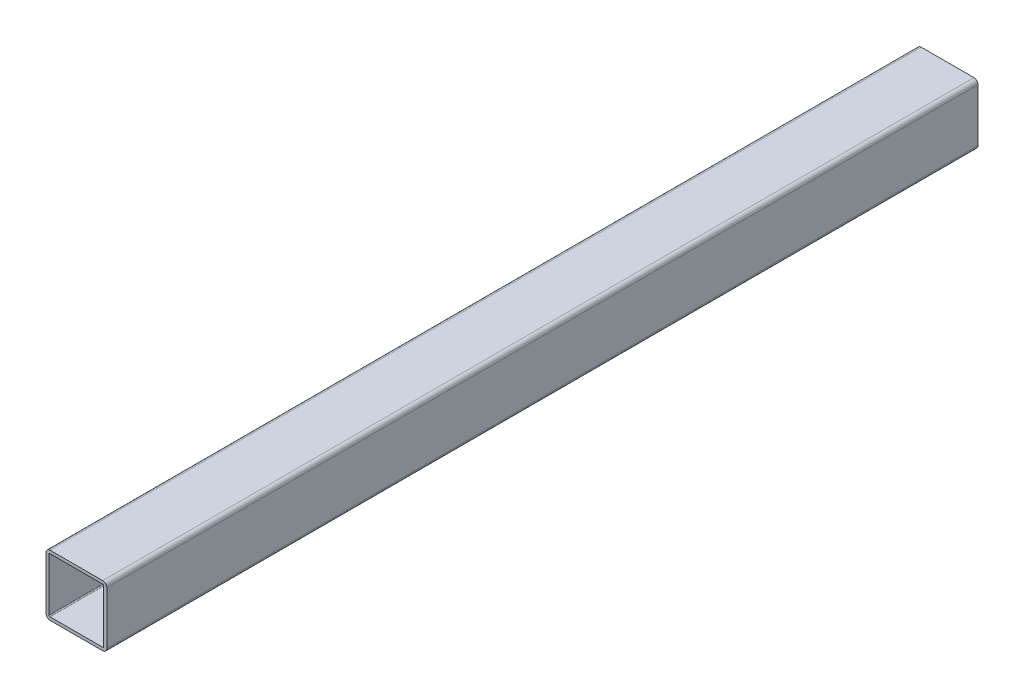
ISO-10303-21;
HEADER;
FILE_DESCRIPTION(('STEP AP214'),'2;1');
FILE_NAME('part.step','',(''),(''),'','','');
FILE_SCHEMA(('AUTOMOTIVE_DESIGN { 1 0 10303 214 1 1 1 1 }'));
ENDSEC;
DATA;
#1=APPLICATION_CONTEXT('core data for automotive mechanical design processes');
#2=APPLICATION_PROTOCOL_DEFINITION('international standard','automotive_design',2000,#1);
#3=PRODUCT_CONTEXT('',#1,'mechanical');
#4=PRODUCT('Part','Part','',(#3));
#5=PRODUCT_RELATED_PRODUCT_CATEGORY('part','',(#4));
#6=PRODUCT_DEFINITION_FORMATION('','',#4);
#7=PRODUCT_DEFINITION_CONTEXT('part definition',#1,'design');
#8=PRODUCT_DEFINITION('design','',#6,#7);
#9=PRODUCT_DEFINITION_SHAPE('','',#8);
#10=(LENGTH_UNIT() NAMED_UNIT(*) SI_UNIT(.MILLI.,.METRE.));
#11=(NAMED_UNIT(*) PLANE_ANGLE_UNIT() SI_UNIT($,.RADIAN.));
#12=(NAMED_UNIT(*) SI_UNIT($,.STERADIAN.) SOLID_ANGLE_UNIT());
#13=UNCERTAINTY_MEASURE_WITH_UNIT(LENGTH_MEASURE(1.E-05),#10,'distance_accuracy_value','');
#14=(GEOMETRIC_REPRESENTATION_CONTEXT(3) GLOBAL_UNCERTAINTY_ASSIGNED_CONTEXT((#13)) GLOBAL_UNIT_ASSIGNED_CONTEXT((#10,
#11,#12)) REPRESENTATION_CONTEXT('',''));
#15=CARTESIAN_POINT('',(0.,0.,0.));
#16=DIRECTION('',(0.,0.,1.));
#17=DIRECTION('',(1.,0.,0.));
#18=AXIS2_PLACEMENT_3D('',#15,#16,#17);
#19=CARTESIAN_POINT('',(2.,2.,430.));
#20=DIRECTION('',(0.,0.,1.));
#21=DIRECTION('',(1.,0.,0.));
#22=AXIS2_PLACEMENT_3D('',#19,#20,#21);
#23=PLANE('',#22);
#24=CARTESIAN_POINT('',(2.,2.,430.));
#25=DIRECTION('',(0.,0.,1.));
#26=DIRECTION('',(1.,0.,0.));
#27=AXIS2_PLACEMENT_3D('',#24,#25,#26);
#28=CIRCLE('',#27,2.);
#29=CARTESIAN_POINT('',(0.,2.00000000000001,430.));
#30=VERTEX_POINT('',#29);
#31=CARTESIAN_POINT('',(2.00000000000001,0.,430.));
#32=VERTEX_POINT('',#31);
#33=EDGE_CURVE('E260',#30,#32,#28,.T.);
#34=ORIENTED_EDGE('',*,*,#33,.T.);
#35=DIRECTION('',(1.,0.,0.));
#36=VECTOR('',#35,1.);
#37=CARTESIAN_POINT('',(2.00000000000001,0.,430.));
#38=LINE('',#37,#36);
#39=CARTESIAN_POINT('',(28.,0.,430.));
#40=VERTEX_POINT('',#39);
#41=EDGE_CURVE('E263',#32,#40,#38,.T.);
#42=ORIENTED_EDGE('',*,*,#41,.T.);
#43=CARTESIAN_POINT('',(28.,2.,430.));
#44=DIRECTION('',(0.,0.,1.));
#45=DIRECTION('',(-1.,0.,0.));
#46=AXIS2_PLACEMENT_3D('',#43,#44,#45);
#47=CIRCLE('',#46,2.);
#48=CARTESIAN_POINT('',(30.,2.00000000000001,430.));
#49=VERTEX_POINT('',#48);
#50=EDGE_CURVE('E266',#40,#49,#47,.T.);
#51=ORIENTED_EDGE('',*,*,#50,.T.);
#52=DIRECTION('',(0.,1.,0.));
#53=VECTOR('',#52,1.);
#54=CARTESIAN_POINT('',(30.,2.00000000000001,430.));
#55=LINE('',#54,#53);
#56=CARTESIAN_POINT('',(30.,28.,430.));
#57=VERTEX_POINT('',#56);
#58=EDGE_CURVE('E268',#49,#57,#55,.T.);
#59=ORIENTED_EDGE('',*,*,#58,.T.);
#60=CARTESIAN_POINT('',(28.,28.,430.));
#61=DIRECTION('',(0.,0.,1.));
#62=DIRECTION('',(-1.,0.,0.));
#63=AXIS2_PLACEMENT_3D('',#60,#61,#62);
#64=CIRCLE('',#63,2.);
#65=CARTESIAN_POINT('',(28.,30.,430.));
#66=VERTEX_POINT('',#65);
#67=EDGE_CURVE('E270',#57,#66,#64,.T.);
#68=ORIENTED_EDGE('',*,*,#67,.T.);
#69=DIRECTION('',(-1.,0.,0.));
#70=VECTOR('',#69,1.);
#71=CARTESIAN_POINT('',(2.00000000000001,30.,430.));
#72=LINE('',#71,#70);
#73=CARTESIAN_POINT('',(2.00000000000001,30.,430.));
#74=VERTEX_POINT('',#73);
#75=EDGE_CURVE('E272',#66,#74,#72,.T.);
#76=ORIENTED_EDGE('',*,*,#75,.T.);
#77=CARTESIAN_POINT('',(2.,28.,430.));
#78=DIRECTION('',(0.,0.,1.));
#79=DIRECTION('',(1.,0.,0.));
#80=AXIS2_PLACEMENT_3D('',#77,#78,#79);
#81=CIRCLE('',#80,2.);
#82=CARTESIAN_POINT('',(0.,28.,430.));
#83=VERTEX_POINT('',#82);
#84=EDGE_CURVE('E274',#74,#83,#81,.T.);
#85=ORIENTED_EDGE('',*,*,#84,.T.);
#86=DIRECTION('',(0.,-1.,0.));
#87=VECTOR('',#86,1.);
#88=CARTESIAN_POINT('',(0.,2.00000000000001,430.));
#89=LINE('',#88,#87);
#90=EDGE_CURVE('E276',#83,#30,#89,.T.);
#91=ORIENTED_EDGE('',*,*,#90,.T.);
#92=EDGE_LOOP('',(#34,#42,#51,#59,#68,#76,#85,#91));
#93=FACE_BOUND('',#92,.T.);
#94=DIRECTION('',(1.,0.,0.));
#95=VECTOR('',#94,1.);
#96=CARTESIAN_POINT('',(2.00000000000001,1.5,430.));
#97=LINE('',#96,#95);
#98=CARTESIAN_POINT('',(2.00000000000001,1.5,430.));
#99=VERTEX_POINT('',#98);
#100=CARTESIAN_POINT('',(28.,1.5,430.));
#101=VERTEX_POINT('',#100);
#102=EDGE_CURVE('E203',#99,#101,#97,.T.);
#103=ORIENTED_EDGE('',*,*,#102,.F.);
#104=CARTESIAN_POINT('',(2.,2.,430.));
#105=DIRECTION('',(0.,0.,1.));
#106=DIRECTION('',(1.,0.,0.));
#107=AXIS2_PLACEMENT_3D('',#104,#105,#106);
#108=CIRCLE('',#107,0.5);
#109=CARTESIAN_POINT('',(1.5,2.00000000000001,430.));
#110=VERTEX_POINT('',#109);
#111=EDGE_CURVE('E195',#110,#99,#108,.T.);
#112=ORIENTED_EDGE('',*,*,#111,.F.);
#113=DIRECTION('',(0.,-1.,0.));
#114=VECTOR('',#113,1.);
#115=CARTESIAN_POINT('',(1.5,2.00000000000001,430.));
#116=LINE('',#115,#114);
#117=CARTESIAN_POINT('',(1.5,28.,430.));
#118=VERTEX_POINT('',#117);
#119=EDGE_CURVE('E228',#118,#110,#116,.T.);
#120=ORIENTED_EDGE('',*,*,#119,.F.);
#121=CARTESIAN_POINT('',(2.,28.,430.));
#122=DIRECTION('',(0.,0.,1.));
#123=DIRECTION('',(1.,0.,0.));
#124=AXIS2_PLACEMENT_3D('',#121,#122,#123);
#125=CIRCLE('',#124,0.500000000000001);
#126=CARTESIAN_POINT('',(2.00000000000001,28.5,430.));
#127=VERTEX_POINT('',#126);
#128=EDGE_CURVE('E226',#127,#118,#125,.T.);
#129=ORIENTED_EDGE('',*,*,#128,.F.);
#130=DIRECTION('',(-1.,0.,0.));
#131=VECTOR('',#130,1.);
#132=CARTESIAN_POINT('',(2.00000000000001,28.5,430.));
#133=LINE('',#132,#131);
#134=CARTESIAN_POINT('',(28.,28.5,430.));
#135=VERTEX_POINT('',#134);
#136=EDGE_CURVE('E224',#135,#127,#133,.T.);
#137=ORIENTED_EDGE('',*,*,#136,.F.);
#138=CARTESIAN_POINT('',(28.,28.,430.));
#139=DIRECTION('',(0.,0.,1.));
#140=DIRECTION('',(1.,0.,0.));
#141=AXIS2_PLACEMENT_3D('',#138,#139,#140);
#142=CIRCLE('',#141,0.500000000000002);
#143=CARTESIAN_POINT('',(28.5,28.,430.));
#144=VERTEX_POINT('',#143);
#145=EDGE_CURVE('E222',#144,#135,#142,.T.);
#146=ORIENTED_EDGE('',*,*,#145,.F.);
#147=DIRECTION('',(0.,1.,0.));
#148=VECTOR('',#147,1.);
#149=CARTESIAN_POINT('',(28.5,2.00000000000001,430.));
#150=LINE('',#149,#148);
#151=CARTESIAN_POINT('',(28.5,2.,430.));
#152=VERTEX_POINT('',#151);
#153=EDGE_CURVE('E218',#152,#144,#150,.T.);
#154=ORIENTED_EDGE('',*,*,#153,.F.);
#155=CARTESIAN_POINT('',(28.,2.,430.));
#156=DIRECTION('',(0.,0.,1.));
#157=DIRECTION('',(1.,0.,0.));
#158=AXIS2_PLACEMENT_3D('',#155,#156,#157);
#159=CIRCLE('',#158,0.500000000000001);
#160=EDGE_CURVE('E216',#101,#152,#159,.T.);
#161=ORIENTED_EDGE('',*,*,#160,.F.);
#162=EDGE_LOOP('',(#103,#112,#120,#129,#137,#146,#154,#161));
#163=FACE_BOUND('',#162,.T.);
#164=ADVANCED_FACE('F82',(#93,#163),#23,.T.);
#165=CARTESIAN_POINT('',(2.,2.,0.));
#166=DIRECTION('',(0.,0.,1.));
#167=DIRECTION('',(1.,0.,0.));
#168=AXIS2_PLACEMENT_3D('',#165,#166,#167);
#169=PLANE('',#168);
#170=CARTESIAN_POINT('',(2.,2.,0.));
#171=DIRECTION('',(0.,0.,1.));
#172=DIRECTION('',(1.,0.,0.));
#173=AXIS2_PLACEMENT_3D('',#170,#171,#172);
#174=CIRCLE('',#173,2.);
#175=CARTESIAN_POINT('',(0.,2.00000000000001,0.));
#176=VERTEX_POINT('',#175);
#177=CARTESIAN_POINT('',(2.00000000000001,0.,0.));
#178=VERTEX_POINT('',#177);
#179=EDGE_CURVE('E211',#176,#178,#174,.T.);
#180=ORIENTED_EDGE('',*,*,#179,.F.);
#181=DIRECTION('',(0.,-1.,0.));
#182=VECTOR('',#181,1.);
#183=CARTESIAN_POINT('',(0.,2.00000000000001,0.));
#184=LINE('',#183,#182);
#185=CARTESIAN_POINT('',(0.,28.,0.));
#186=VERTEX_POINT('',#185);
#187=EDGE_CURVE('E264',#186,#176,#184,.T.);
#188=ORIENTED_EDGE('',*,*,#187,.F.);
#189=CARTESIAN_POINT('',(2.,28.,0.));
#190=DIRECTION('',(0.,0.,1.));
#191=DIRECTION('',(1.,0.,0.));
#192=AXIS2_PLACEMENT_3D('',#189,#190,#191);
#193=CIRCLE('',#192,2.);
#194=CARTESIAN_POINT('',(2.00000000000001,30.,0.));
#195=VERTEX_POINT('',#194);
#196=EDGE_CURVE('E291',#195,#186,#193,.T.);
#197=ORIENTED_EDGE('',*,*,#196,.F.);
#198=DIRECTION('',(-1.,0.,0.));
#199=VECTOR('',#198,1.);
#200=CARTESIAN_POINT('',(2.00000000000001,30.,0.));
#201=LINE('',#200,#199);
#202=CARTESIAN_POINT('',(28.,30.,0.));
#203=VERTEX_POINT('',#202);
#204=EDGE_CURVE('E289',#203,#195,#201,.T.);
#205=ORIENTED_EDGE('',*,*,#204,.F.);
#206=CARTESIAN_POINT('',(28.,28.,0.));
#207=DIRECTION('',(0.,0.,1.));
#208=DIRECTION('',(-1.,0.,0.));
#209=AXIS2_PLACEMENT_3D('',#206,#207,#208);
#210=CIRCLE('',#209,2.);
#211=CARTESIAN_POINT('',(30.,28.,0.));
#212=VERTEX_POINT('',#211);
#213=EDGE_CURVE('E287',#212,#203,#210,.T.);
#214=ORIENTED_EDGE('',*,*,#213,.F.);
#215=DIRECTION('',(0.,1.,0.));
#216=VECTOR('',#215,1.);
#217=CARTESIAN_POINT('',(30.,2.00000000000001,0.));
#218=LINE('',#217,#216);
#219=CARTESIAN_POINT('',(30.,2.00000000000001,0.));
#220=VERTEX_POINT('',#219);
#221=EDGE_CURVE('E285',#220,#212,#218,.T.);
#222=ORIENTED_EDGE('',*,*,#221,.F.);
#223=CARTESIAN_POINT('',(28.,2.,0.));
#224=DIRECTION('',(0.,0.,1.));
#225=DIRECTION('',(-1.,0.,0.));
#226=AXIS2_PLACEMENT_3D('',#223,#224,#225);
#227=CIRCLE('',#226,2.);
#228=CARTESIAN_POINT('',(28.,0.,0.));
#229=VERTEX_POINT('',#228);
#230=EDGE_CURVE('E283',#229,#220,#227,.T.);
#231=ORIENTED_EDGE('',*,*,#230,.F.);
#232=DIRECTION('',(1.,0.,0.));
#233=VECTOR('',#232,1.);
#234=CARTESIAN_POINT('',(2.00000000000001,0.,0.));
#235=LINE('',#234,#233);
#236=EDGE_CURVE('E281',#178,#229,#235,.T.);
#237=ORIENTED_EDGE('',*,*,#236,.F.);
#238=EDGE_LOOP('',(#180,#188,#197,#205,#214,#222,#231,#237));
#239=FACE_BOUND('',#238,.T.);
#240=CARTESIAN_POINT('',(2.,2.,0.));
#241=DIRECTION('',(0.,0.,1.));
#242=DIRECTION('',(1.,0.,0.));
#243=AXIS2_PLACEMENT_3D('',#240,#241,#242);
#244=CIRCLE('',#243,0.5);
#245=CARTESIAN_POINT('',(1.5,2.00000000000001,0.));
#246=VERTEX_POINT('',#245);
#247=CARTESIAN_POINT('',(2.00000000000001,1.5,0.));
#248=VERTEX_POINT('',#247);
#249=EDGE_CURVE('E105',#246,#248,#244,.T.);
#250=ORIENTED_EDGE('',*,*,#249,.T.);
#251=DIRECTION('',(1.,0.,0.));
#252=VECTOR('',#251,1.);
#253=CARTESIAN_POINT('',(2.00000000000001,1.5,0.));
#254=LINE('',#253,#252);
#255=CARTESIAN_POINT('',(28.,1.5,0.));
#256=VERTEX_POINT('',#255);
#257=EDGE_CURVE('E210',#248,#256,#254,.T.);
#258=ORIENTED_EDGE('',*,*,#257,.T.);
#259=CARTESIAN_POINT('',(28.,2.,0.));
#260=DIRECTION('',(0.,0.,1.));
#261=DIRECTION('',(1.,0.,0.));
#262=AXIS2_PLACEMENT_3D('',#259,#260,#261);
#263=CIRCLE('',#262,0.500000000000001);
#264=CARTESIAN_POINT('',(28.5,2.,0.));
#265=VERTEX_POINT('',#264);
#266=EDGE_CURVE('E232',#256,#265,#263,.T.);
#267=ORIENTED_EDGE('',*,*,#266,.T.);
#268=DIRECTION('',(0.,1.,0.));
#269=VECTOR('',#268,1.);
#270=CARTESIAN_POINT('',(28.5,2.00000000000001,0.));
#271=LINE('',#270,#269);
#272=CARTESIAN_POINT('',(28.5,28.,0.));
#273=VERTEX_POINT('',#272);
#274=EDGE_CURVE('E235',#265,#273,#271,.T.);
#275=ORIENTED_EDGE('',*,*,#274,.T.);
#276=CARTESIAN_POINT('',(28.,28.,0.));
#277=DIRECTION('',(0.,0.,1.));
#278=DIRECTION('',(1.,0.,0.));
#279=AXIS2_PLACEMENT_3D('',#276,#277,#278);
#280=CIRCLE('',#279,0.500000000000002);
#281=CARTESIAN_POINT('',(28.,28.5,0.));
#282=VERTEX_POINT('',#281);
#283=EDGE_CURVE('E238',#273,#282,#280,.T.);
#284=ORIENTED_EDGE('',*,*,#283,.T.);
#285=DIRECTION('',(-1.,0.,0.));
#286=VECTOR('',#285,1.);
#287=CARTESIAN_POINT('',(2.00000000000001,28.5,0.));
#288=LINE('',#287,#286);
#289=CARTESIAN_POINT('',(2.00000000000001,28.5,0.));
#290=VERTEX_POINT('',#289);
#291=EDGE_CURVE('E241',#282,#290,#288,.T.);
#292=ORIENTED_EDGE('',*,*,#291,.T.);
#293=CARTESIAN_POINT('',(2.,28.,0.));
#294=DIRECTION('',(0.,0.,1.));
#295=DIRECTION('',(1.,0.,0.));
#296=AXIS2_PLACEMENT_3D('',#293,#294,#295);
#297=CIRCLE('',#296,0.500000000000001);
#298=CARTESIAN_POINT('',(1.5,28.,0.));
#299=VERTEX_POINT('',#298);
#300=EDGE_CURVE('E244',#290,#299,#297,.T.);
#301=ORIENTED_EDGE('',*,*,#300,.T.);
#302=DIRECTION('',(0.,-1.,0.));
#303=VECTOR('',#302,1.);
#304=CARTESIAN_POINT('',(1.5,2.00000000000001,0.));
#305=LINE('',#304,#303);
#306=EDGE_CURVE('E204',#299,#246,#305,.T.);
#307=ORIENTED_EDGE('',*,*,#306,.T.);
#308=EDGE_LOOP('',(#250,#258,#267,#275,#284,#292,#301,#307));
#309=FACE_BOUND('',#308,.T.);
#310=ADVANCED_FACE('F321',(#239,#309),#169,.F.);
#311=CARTESIAN_POINT('',(2.,2.,430.));
#312=DIRECTION('',(0.,0.,-1.));
#313=DIRECTION('',(-1.,0.,0.));
#314=AXIS2_PLACEMENT_3D('',#311,#312,#313);
#315=CYLINDRICAL_SURFACE('',#314,2.);
#316=ORIENTED_EDGE('',*,*,#179,.T.);
#317=DIRECTION('',(0.,0.,-1.));
#318=VECTOR('',#317,1.);
#319=CARTESIAN_POINT('',(2.00000000000001,0.,430.));
#320=LINE('',#319,#318);
#321=EDGE_CURVE('E12',#32,#178,#320,.T.);
#322=ORIENTED_EDGE('',*,*,#321,.F.);
#323=ORIENTED_EDGE('',*,*,#33,.F.);
#324=DIRECTION('',(0.,0.,-1.));
#325=VECTOR('',#324,1.);
#326=CARTESIAN_POINT('',(0.,2.00000000000001,430.));
#327=LINE('',#326,#325);
#328=EDGE_CURVE('E278',#30,#176,#327,.T.);
#329=ORIENTED_EDGE('',*,*,#328,.T.);
#330=EDGE_LOOP('',(#316,#322,#323,#329));
#331=FACE_BOUND('',#330,.T.);
#332=ADVANCED_FACE('F84',(#331),#315,.T.);
#333=CARTESIAN_POINT('',(2.00000000000001,0.,430.));
#334=DIRECTION('',(0.,1.,0.));
#335=DIRECTION('',(0.,0.,1.));
#336=AXIS2_PLACEMENT_3D('',#333,#334,#335);
#337=PLANE('',#336);
#338=ORIENTED_EDGE('',*,*,#236,.T.);
#339=DIRECTION('',(0.,0.,-1.));
#340=VECTOR('',#339,1.);
#341=CARTESIAN_POINT('',(28.,0.,430.));
#342=LINE('',#341,#340);
#343=EDGE_CURVE('E90',#40,#229,#342,.T.);
#344=ORIENTED_EDGE('',*,*,#343,.F.);
#345=ORIENTED_EDGE('',*,*,#41,.F.);
#346=ORIENTED_EDGE('',*,*,#321,.T.);
#347=EDGE_LOOP('',(#338,#344,#345,#346));
#348=FACE_BOUND('',#347,.T.);
#349=ADVANCED_FACE('F338',(#348),#337,.F.);
#350=CARTESIAN_POINT('',(28.,2.,430.));
#351=DIRECTION('',(0.,0.,-1.));
#352=DIRECTION('',(-1.,0.,0.));
#353=AXIS2_PLACEMENT_3D('',#350,#351,#352);
#354=CYLINDRICAL_SURFACE('',#353,2.);
#355=ORIENTED_EDGE('',*,*,#230,.T.);
#356=DIRECTION('',(0.,0.,-1.));
#357=VECTOR('',#356,1.);
#358=CARTESIAN_POINT('',(30.,2.00000000000001,430.));
#359=LINE('',#358,#357);
#360=EDGE_CURVE('E308',#49,#220,#359,.T.);
#361=ORIENTED_EDGE('',*,*,#360,.F.);
#362=ORIENTED_EDGE('',*,*,#50,.F.);
#363=ORIENTED_EDGE('',*,*,#343,.T.);
#364=EDGE_LOOP('',(#355,#361,#362,#363));
#365=FACE_BOUND('',#364,.T.);
#366=ADVANCED_FACE('F315',(#365),#354,.T.);
#367=CARTESIAN_POINT('',(30.,2.00000000000001,430.));
#368=DIRECTION('',(-1.,0.,0.));
#369=DIRECTION('',(0.,0.,1.));
#370=AXIS2_PLACEMENT_3D('',#367,#368,#369);
#371=PLANE('',#370);
#372=ORIENTED_EDGE('',*,*,#221,.T.);
#373=DIRECTION('',(0.,0.,-1.));
#374=VECTOR('',#373,1.);
#375=CARTESIAN_POINT('',(30.,28.,430.));
#376=LINE('',#375,#374);
#377=EDGE_CURVE('E305',#57,#212,#376,.T.);
#378=ORIENTED_EDGE('',*,*,#377,.F.);
#379=ORIENTED_EDGE('',*,*,#58,.F.);
#380=ORIENTED_EDGE('',*,*,#360,.T.);
#381=EDGE_LOOP('',(#372,#378,#379,#380));
#382=FACE_BOUND('',#381,.T.);
#383=ADVANCED_FACE('F327',(#382),#371,.F.);
#384=CARTESIAN_POINT('',(28.,28.,430.));
#385=DIRECTION('',(0.,0.,-1.));
#386=DIRECTION('',(-1.,0.,0.));
#387=AXIS2_PLACEMENT_3D('',#384,#385,#386);
#388=CYLINDRICAL_SURFACE('',#387,2.);
#389=ORIENTED_EDGE('',*,*,#213,.T.);
#390=DIRECTION('',(0.,0.,-1.));
#391=VECTOR('',#390,1.);
#392=CARTESIAN_POINT('',(28.,30.,430.));
#393=LINE('',#392,#391);
#394=EDGE_CURVE('E302',#66,#203,#393,.T.);
#395=ORIENTED_EDGE('',*,*,#394,.F.);
#396=ORIENTED_EDGE('',*,*,#67,.F.);
#397=ORIENTED_EDGE('',*,*,#377,.T.);
#398=EDGE_LOOP('',(#389,#395,#396,#397));
#399=FACE_BOUND('',#398,.T.);
#400=ADVANCED_FACE('F331',(#399),#388,.T.);
#401=CARTESIAN_POINT('',(2.00000000000001,30.,430.));
#402=DIRECTION('',(0.,-1.,0.));
#403=DIRECTION('',(0.,0.,-1.));
#404=AXIS2_PLACEMENT_3D('',#401,#402,#403);
#405=PLANE('',#404);
#406=ORIENTED_EDGE('',*,*,#204,.T.);
#407=DIRECTION('',(0.,0.,-1.));
#408=VECTOR('',#407,1.);
#409=CARTESIAN_POINT('',(2.00000000000001,30.,430.));
#410=LINE('',#409,#408);
#411=EDGE_CURVE('E299',#74,#195,#410,.T.);
#412=ORIENTED_EDGE('',*,*,#411,.F.);
#413=ORIENTED_EDGE('',*,*,#75,.F.);
#414=ORIENTED_EDGE('',*,*,#394,.T.);
#415=EDGE_LOOP('',(#406,#412,#413,#414));
#416=FACE_BOUND('',#415,.T.);
#417=ADVANCED_FACE('F351',(#416),#405,.F.);
#418=CARTESIAN_POINT('',(2.,28.,430.));
#419=DIRECTION('',(0.,0.,-1.));
#420=DIRECTION('',(-1.,0.,0.));
#421=AXIS2_PLACEMENT_3D('',#418,#419,#420);
#422=CYLINDRICAL_SURFACE('',#421,2.);
#423=ORIENTED_EDGE('',*,*,#196,.T.);
#424=DIRECTION('',(0.,0.,-1.));
#425=VECTOR('',#424,1.);
#426=CARTESIAN_POINT('',(0.,28.,430.));
#427=LINE('',#426,#425);
#428=EDGE_CURVE('E296',#83,#186,#427,.T.);
#429=ORIENTED_EDGE('',*,*,#428,.F.);
#430=ORIENTED_EDGE('',*,*,#84,.F.);
#431=ORIENTED_EDGE('',*,*,#411,.T.);
#432=EDGE_LOOP('',(#423,#429,#430,#431));
#433=FACE_BOUND('',#432,.T.);
#434=ADVANCED_FACE('F349',(#433),#422,.T.);
#435=CARTESIAN_POINT('',(0.,2.00000000000001,430.));
#436=DIRECTION('',(1.,0.,0.));
#437=DIRECTION('',(0.,0.,-1.));
#438=AXIS2_PLACEMENT_3D('',#435,#436,#437);
#439=PLANE('',#438);
#440=ORIENTED_EDGE('',*,*,#187,.T.);
#441=ORIENTED_EDGE('',*,*,#328,.F.);
#442=ORIENTED_EDGE('',*,*,#90,.F.);
#443=ORIENTED_EDGE('',*,*,#428,.T.);
#444=EDGE_LOOP('',(#440,#441,#442,#443));
#445=FACE_BOUND('',#444,.T.);
#446=ADVANCED_FACE('F344',(#445),#439,.F.);
#447=CARTESIAN_POINT('',(2.,2.,430.));
#448=DIRECTION('',(0.,0.,-1.));
#449=DIRECTION('',(-1.,0.,0.));
#450=AXIS2_PLACEMENT_3D('',#447,#448,#449);
#451=CYLINDRICAL_SURFACE('',#450,0.5);
#452=ORIENTED_EDGE('',*,*,#249,.F.);
#453=DIRECTION('',(0.,0.,-1.));
#454=VECTOR('',#453,1.);
#455=CARTESIAN_POINT('',(1.5,2.00000000000001,430.));
#456=LINE('',#455,#454);
#457=EDGE_CURVE('E199',#110,#246,#456,.T.);
#458=ORIENTED_EDGE('',*,*,#457,.F.);
#459=ORIENTED_EDGE('',*,*,#111,.T.);
#460=DIRECTION('',(0.,0.,-1.));
#461=VECTOR('',#460,1.);
#462=CARTESIAN_POINT('',(2.00000000000001,1.5,430.));
#463=LINE('',#462,#461);
#464=EDGE_CURVE('E198',#99,#248,#463,.T.);
#465=ORIENTED_EDGE('',*,*,#464,.T.);
#466=EDGE_LOOP('',(#452,#458,#459,#465));
#467=FACE_BOUND('',#466,.T.);
#468=ADVANCED_FACE('F197',(#467),#451,.F.);
#469=CARTESIAN_POINT('',(2.00000000000001,1.5,430.));
#470=DIRECTION('',(0.,1.,0.));
#471=DIRECTION('',(0.,0.,1.));
#472=AXIS2_PLACEMENT_3D('',#469,#470,#471);
#473=PLANE('',#472);
#474=ORIENTED_EDGE('',*,*,#257,.F.);
#475=ORIENTED_EDGE('',*,*,#464,.F.);
#476=ORIENTED_EDGE('',*,*,#102,.T.);
#477=DIRECTION('',(0.,0.,-1.));
#478=VECTOR('',#477,1.);
#479=CARTESIAN_POINT('',(28.,1.5,430.));
#480=LINE('',#479,#478);
#481=EDGE_CURVE('E212',#101,#256,#480,.T.);
#482=ORIENTED_EDGE('',*,*,#481,.T.);
#483=EDGE_LOOP('',(#474,#475,#476,#482));
#484=FACE_BOUND('',#483,.T.);
#485=ADVANCED_FACE('F207',(#484),#473,.T.);
#486=CARTESIAN_POINT('',(28.,2.,430.));
#487=DIRECTION('',(0.,0.,-1.));
#488=DIRECTION('',(-1.,0.,0.));
#489=AXIS2_PLACEMENT_3D('',#486,#487,#488);
#490=CYLINDRICAL_SURFACE('',#489,0.500000000000001);
#491=ORIENTED_EDGE('',*,*,#266,.F.);
#492=ORIENTED_EDGE('',*,*,#481,.F.);
#493=ORIENTED_EDGE('',*,*,#160,.T.);
#494=DIRECTION('',(0.,0.,-1.));
#495=VECTOR('',#494,1.);
#496=CARTESIAN_POINT('',(28.5,2.,430.));
#497=LINE('',#496,#495);
#498=EDGE_CURVE('E257',#152,#265,#497,.T.);
#499=ORIENTED_EDGE('',*,*,#498,.T.);
#500=EDGE_LOOP('',(#491,#492,#493,#499));
#501=FACE_BOUND('',#500,.T.);
#502=ADVANCED_FACE('F376',(#501),#490,.F.);
#503=CARTESIAN_POINT('',(28.5,2.00000000000001,430.));
#504=DIRECTION('',(-1.,0.,0.));
#505=DIRECTION('',(0.,0.,1.));
#506=AXIS2_PLACEMENT_3D('',#503,#504,#505);
#507=PLANE('',#506);
#508=ORIENTED_EDGE('',*,*,#274,.F.);
#509=ORIENTED_EDGE('',*,*,#498,.F.);
#510=ORIENTED_EDGE('',*,*,#153,.T.);
#511=DIRECTION('',(0.,0.,-1.));
#512=VECTOR('',#511,1.);
#513=CARTESIAN_POINT('',(28.5,28.,430.));
#514=LINE('',#513,#512);
#515=EDGE_CURVE('E255',#144,#273,#514,.T.);
#516=ORIENTED_EDGE('',*,*,#515,.T.);
#517=EDGE_LOOP('',(#508,#509,#510,#516));
#518=FACE_BOUND('',#517,.T.);
#519=ADVANCED_FACE('F380',(#518),#507,.T.);
#520=CARTESIAN_POINT('',(28.,28.,430.));
#521=DIRECTION('',(0.,0.,-1.));
#522=DIRECTION('',(-1.,0.,0.));
#523=AXIS2_PLACEMENT_3D('',#520,#521,#522);
#524=CYLINDRICAL_SURFACE('',#523,0.500000000000002);
#525=ORIENTED_EDGE('',*,*,#283,.F.);
#526=ORIENTED_EDGE('',*,*,#515,.F.);
#527=ORIENTED_EDGE('',*,*,#145,.T.);
#528=DIRECTION('',(0.,0.,-1.));
#529=VECTOR('',#528,1.);
#530=CARTESIAN_POINT('',(28.,28.5,430.));
#531=LINE('',#530,#529);
#532=EDGE_CURVE('E253',#135,#282,#531,.T.);
#533=ORIENTED_EDGE('',*,*,#532,.T.);
#534=EDGE_LOOP('',(#525,#526,#527,#533));
#535=FACE_BOUND('',#534,.T.);
#536=ADVANCED_FACE('F386',(#535),#524,.F.);
#537=CARTESIAN_POINT('',(2.00000000000001,28.5,430.));
#538=DIRECTION('',(0.,-1.,0.));
#539=DIRECTION('',(0.,0.,-1.));
#540=AXIS2_PLACEMENT_3D('',#537,#538,#539);
#541=PLANE('',#540);
#542=ORIENTED_EDGE('',*,*,#291,.F.);
#543=ORIENTED_EDGE('',*,*,#532,.F.);
#544=ORIENTED_EDGE('',*,*,#136,.T.);
#545=DIRECTION('',(0.,0.,-1.));
#546=VECTOR('',#545,1.);
#547=CARTESIAN_POINT('',(2.00000000000001,28.5,430.));
#548=LINE('',#547,#546);
#549=EDGE_CURVE('E251',#127,#290,#548,.T.);
#550=ORIENTED_EDGE('',*,*,#549,.T.);
#551=EDGE_LOOP('',(#542,#543,#544,#550));
#552=FACE_BOUND('',#551,.T.);
#553=ADVANCED_FACE('F390',(#552),#541,.T.);
#554=CARTESIAN_POINT('',(2.,28.,430.));
#555=DIRECTION('',(0.,0.,-1.));
#556=DIRECTION('',(-1.,0.,0.));
#557=AXIS2_PLACEMENT_3D('',#554,#555,#556);
#558=CYLINDRICAL_SURFACE('',#557,0.500000000000001);
#559=ORIENTED_EDGE('',*,*,#300,.F.);
#560=ORIENTED_EDGE('',*,*,#549,.F.);
#561=ORIENTED_EDGE('',*,*,#128,.T.);
#562=DIRECTION('',(0.,0.,-1.));
#563=VECTOR('',#562,1.);
#564=CARTESIAN_POINT('',(1.5,28.,430.));
#565=LINE('',#564,#563);
#566=EDGE_CURVE('E97',#118,#299,#565,.T.);
#567=ORIENTED_EDGE('',*,*,#566,.T.);
#568=EDGE_LOOP('',(#559,#560,#561,#567));
#569=FACE_BOUND('',#568,.T.);
#570=ADVANCED_FACE('F394',(#569),#558,.F.);
#571=CARTESIAN_POINT('',(1.5,2.00000000000001,430.));
#572=DIRECTION('',(1.,0.,0.));
#573=DIRECTION('',(0.,0.,-1.));
#574=AXIS2_PLACEMENT_3D('',#571,#572,#573);
#575=PLANE('',#574);
#576=ORIENTED_EDGE('',*,*,#306,.F.);
#577=ORIENTED_EDGE('',*,*,#566,.F.);
#578=ORIENTED_EDGE('',*,*,#119,.T.);
#579=ORIENTED_EDGE('',*,*,#457,.T.);
#580=EDGE_LOOP('',(#576,#577,#578,#579));
#581=FACE_BOUND('',#580,.T.);
#582=ADVANCED_FACE('F398',(#581),#575,.T.);
#583=CLOSED_SHELL('',(#164,#310,#332,#349,#366,#383,#400,#417,#434,#446,#468,#485,#502,#519,
#536,#553,#570,#582));
#584=MANIFOLD_SOLID_BREP('B2',#583);
#585=ADVANCED_BREP_SHAPE_REPRESENTATION('',(#18,#584),#14);
#586=SHAPE_DEFINITION_REPRESENTATION(#9,#585);
ENDSEC;
END-ISO-10303-21;
